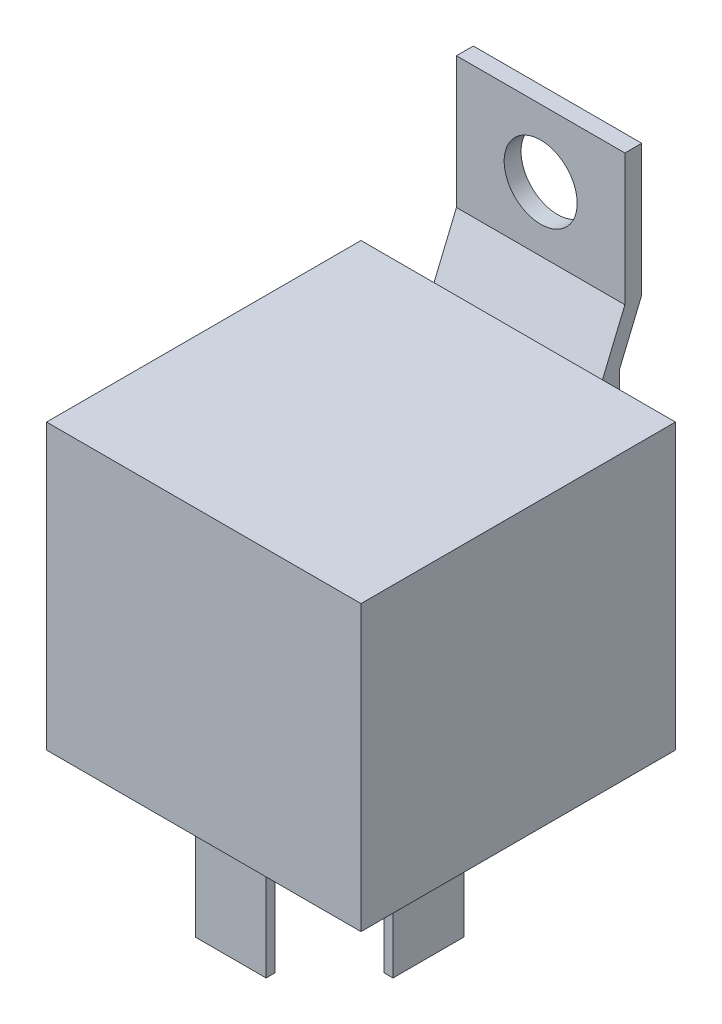
ISO-10303-21;
HEADER;
FILE_DESCRIPTION(('STEP AP214'),'2;1');
FILE_NAME('part.step','',(''),(''),'','','');
FILE_SCHEMA(('AUTOMOTIVE_DESIGN { 1 0 10303 214 1 1 1 1 }'));
ENDSEC;
DATA;
#1=APPLICATION_CONTEXT('core data for automotive mechanical design processes');
#2=APPLICATION_PROTOCOL_DEFINITION('international standard','automotive_design',2000,#1);
#3=PRODUCT_CONTEXT('',#1,'mechanical');
#4=PRODUCT('Part','Part','',(#3));
#5=PRODUCT_RELATED_PRODUCT_CATEGORY('part','',(#4));
#6=PRODUCT_DEFINITION_FORMATION('','',#4);
#7=PRODUCT_DEFINITION_CONTEXT('part definition',#1,'design');
#8=PRODUCT_DEFINITION('design','',#6,#7);
#9=PRODUCT_DEFINITION_SHAPE('','',#8);
#10=(LENGTH_UNIT() NAMED_UNIT(*) SI_UNIT(.MILLI.,.METRE.));
#11=(NAMED_UNIT(*) PLANE_ANGLE_UNIT() SI_UNIT($,.RADIAN.));
#12=(NAMED_UNIT(*) SI_UNIT($,.STERADIAN.) SOLID_ANGLE_UNIT());
#13=UNCERTAINTY_MEASURE_WITH_UNIT(LENGTH_MEASURE(1.E-05),#10,'distance_accuracy_value','');
#14=(GEOMETRIC_REPRESENTATION_CONTEXT(3) GLOBAL_UNCERTAINTY_ASSIGNED_CONTEXT((#13)) GLOBAL_UNIT_ASSIGNED_CONTEXT((#10,
#11,#12)) REPRESENTATION_CONTEXT('',''));
#15=CARTESIAN_POINT('',(0.,0.,0.));
#16=DIRECTION('',(0.,0.,1.));
#17=DIRECTION('',(1.,0.,0.));
#18=AXIS2_PLACEMENT_3D('',#15,#16,#17);
#19=CARTESIAN_POINT('',(-14.,-12.65,28.));
#20=DIRECTION('',(0.,1.,0.));
#21=DIRECTION('',(0.,0.,1.));
#22=AXIS2_PLACEMENT_3D('',#19,#20,#21);
#23=PLANE('',#22);
#24=DIRECTION('',(0.,0.,-1.));
#25=VECTOR('',#24,1.);
#26=CARTESIAN_POINT('',(-3.15,-12.65,17.6));
#27=LINE('',#26,#25);
#28=CARTESIAN_POINT('',(-3.15,-12.65,17.6));
#29=VERTEX_POINT('',#28);
#30=CARTESIAN_POINT('',(-3.15,-12.65,16.8));
#31=VERTEX_POINT('',#30);
#32=EDGE_CURVE('E262',#29,#31,#27,.T.);
#33=ORIENTED_EDGE('',*,*,#32,.F.);
#34=DIRECTION('',(-1.,0.,0.));
#35=VECTOR('',#34,1.);
#36=CARTESIAN_POINT('',(-3.15,-12.65,17.6));
#37=LINE('',#36,#35);
#38=CARTESIAN_POINT('',(3.15,-12.65,17.6));
#39=VERTEX_POINT('',#38);
#40=EDGE_CURVE('E275',#39,#29,#37,.T.);
#41=ORIENTED_EDGE('',*,*,#40,.F.);
#42=DIRECTION('',(0.,0.,1.));
#43=VECTOR('',#42,1.);
#44=CARTESIAN_POINT('',(3.15,-12.65,17.6));
#45=LINE('',#44,#43);
#46=CARTESIAN_POINT('',(3.15,-12.65,16.8));
#47=VERTEX_POINT('',#46);
#48=EDGE_CURVE('E284',#47,#39,#45,.T.);
#49=ORIENTED_EDGE('',*,*,#48,.F.);
#50=DIRECTION('',(1.,0.,0.));
#51=VECTOR('',#50,1.);
#52=CARTESIAN_POINT('',(-3.15,-12.65,16.8));
#53=LINE('',#52,#51);
#54=EDGE_CURVE('E265',#31,#47,#53,.T.);
#55=ORIENTED_EDGE('',*,*,#54,.F.);
#56=EDGE_LOOP('',(#33,#41,#49,#55));
#57=FACE_BOUND('',#56,.T.);
#58=DIRECTION('',(0.,0.,-1.));
#59=VECTOR('',#58,1.);
#60=CARTESIAN_POINT('',(-3.15,-12.65,25.6));
#61=LINE('',#60,#59);
#62=CARTESIAN_POINT('',(-3.15,-12.65,25.6));
#63=VERTEX_POINT('',#62);
#64=CARTESIAN_POINT('',(-3.15,-12.65,24.8));
#65=VERTEX_POINT('',#64);
#66=EDGE_CURVE('E333',#63,#65,#61,.T.);
#67=ORIENTED_EDGE('',*,*,#66,.F.);
#68=DIRECTION('',(-1.,0.,0.));
#69=VECTOR('',#68,1.);
#70=CARTESIAN_POINT('',(-3.15,-12.65,25.6));
#71=LINE('',#70,#69);
#72=CARTESIAN_POINT('',(3.15,-12.65,25.6));
#73=VERTEX_POINT('',#72);
#74=EDGE_CURVE('E338',#73,#63,#71,.T.);
#75=ORIENTED_EDGE('',*,*,#74,.F.);
#76=DIRECTION('',(0.,0.,1.));
#77=VECTOR('',#76,1.);
#78=CARTESIAN_POINT('',(3.15,-12.65,25.6));
#79=LINE('',#78,#77);
#80=CARTESIAN_POINT('',(3.15,-12.65,24.8));
#81=VERTEX_POINT('',#80);
#82=EDGE_CURVE('E350',#81,#73,#79,.T.);
#83=ORIENTED_EDGE('',*,*,#82,.F.);
#84=DIRECTION('',(1.,0.,0.));
#85=VECTOR('',#84,1.);
#86=CARTESIAN_POINT('',(-3.15,-12.65,24.8));
#87=LINE('',#86,#85);
#88=EDGE_CURVE('E347',#65,#81,#87,.T.);
#89=ORIENTED_EDGE('',*,*,#88,.F.);
#90=EDGE_LOOP('',(#67,#75,#83,#89));
#91=FACE_BOUND('',#90,.T.);
#92=DIRECTION('',(1.,0.,0.));
#93=VECTOR('',#92,1.);
#94=CARTESIAN_POINT('',(-14.,-12.65,0.));
#95=LINE('',#94,#93);
#96=CARTESIAN_POINT('',(-14.,-12.65,0.));
#97=VERTEX_POINT('',#96);
#98=CARTESIAN_POINT('',(14.,-12.65,0.));
#99=VERTEX_POINT('',#98);
#100=EDGE_CURVE('E478',#97,#99,#95,.T.);
#101=ORIENTED_EDGE('',*,*,#100,.T.);
#102=DIRECTION('',(0.,0.,-1.));
#103=VECTOR('',#102,1.);
#104=CARTESIAN_POINT('',(14.,-12.65,28.));
#105=LINE('',#104,#103);
#106=CARTESIAN_POINT('',(14.,-12.65,28.));
#107=VERTEX_POINT('',#106);
#108=EDGE_CURVE('E40',#107,#99,#105,.T.);
#109=ORIENTED_EDGE('',*,*,#108,.F.);
#110=DIRECTION('',(1.,0.,0.));
#111=VECTOR('',#110,1.);
#112=CARTESIAN_POINT('',(-14.,-12.65,28.));
#113=LINE('',#112,#111);
#114=CARTESIAN_POINT('',(-14.,-12.65,28.));
#115=VERTEX_POINT('',#114);
#116=EDGE_CURVE('E468',#115,#107,#113,.T.);
#117=ORIENTED_EDGE('',*,*,#116,.F.);
#118=DIRECTION('',(0.,0.,-1.));
#119=VECTOR('',#118,1.);
#120=CARTESIAN_POINT('',(-14.,-12.65,28.));
#121=LINE('',#120,#119);
#122=EDGE_CURVE('E11',#115,#97,#121,.T.);
#123=ORIENTED_EDGE('',*,*,#122,.T.);
#124=EDGE_LOOP('',(#101,#109,#117,#123));
#125=FACE_BOUND('',#124,.T.);
#126=DIRECTION('',(0.,0.,-1.));
#127=VECTOR('',#126,1.);
#128=CARTESIAN_POINT('',(-0.399999999999997,-12.65,10.45));
#129=LINE('',#128,#127);
#130=CARTESIAN_POINT('',(-0.399999999999997,-12.65,10.45));
#131=VERTEX_POINT('',#130);
#132=CARTESIAN_POINT('',(-0.399999999999998,-12.65,4.14999999999999));
#133=VERTEX_POINT('',#132);
#134=EDGE_CURVE('E366',#131,#133,#129,.T.);
#135=ORIENTED_EDGE('',*,*,#134,.F.);
#136=DIRECTION('',(-1.,0.,0.));
#137=VECTOR('',#136,1.);
#138=CARTESIAN_POINT('',(-0.399999999999997,-12.65,10.45));
#139=LINE('',#138,#137);
#140=CARTESIAN_POINT('',(0.400000000000005,-12.65,10.45));
#141=VERTEX_POINT('',#140);
#142=EDGE_CURVE('E371',#141,#131,#139,.T.);
#143=ORIENTED_EDGE('',*,*,#142,.F.);
#144=DIRECTION('',(0.,0.,1.));
#145=VECTOR('',#144,1.);
#146=CARTESIAN_POINT('',(0.400000000000004,-12.65,10.45));
#147=LINE('',#146,#145);
#148=CARTESIAN_POINT('',(0.400000000000004,-12.65,4.15));
#149=VERTEX_POINT('',#148);
#150=EDGE_CURVE('E383',#149,#141,#147,.T.);
#151=ORIENTED_EDGE('',*,*,#150,.F.);
#152=DIRECTION('',(1.,0.,0.));
#153=VECTOR('',#152,1.);
#154=CARTESIAN_POINT('',(-0.399999999999997,-12.65,4.14999999999999));
#155=LINE('',#154,#153);
#156=EDGE_CURVE('E380',#133,#149,#155,.T.);
#157=ORIENTED_EDGE('',*,*,#156,.F.);
#158=EDGE_LOOP('',(#135,#143,#151,#157));
#159=FACE_BOUND('',#158,.T.);
#160=DIRECTION('',(0.,0.,-1.));
#161=VECTOR('',#160,1.);
#162=CARTESIAN_POINT('',(-8.79999999999999,-12.65,19.95));
#163=LINE('',#162,#161);
#164=CARTESIAN_POINT('',(-8.79999999999999,-12.65,19.95));
#165=VERTEX_POINT('',#164);
#166=CARTESIAN_POINT('',(-8.79999999999999,-12.65,13.65));
#167=VERTEX_POINT('',#166);
#168=EDGE_CURVE('E300',#165,#167,#163,.T.);
#169=ORIENTED_EDGE('',*,*,#168,.F.);
#170=DIRECTION('',(-1.,0.,0.));
#171=VECTOR('',#170,1.);
#172=CARTESIAN_POINT('',(-8.79999999999999,-12.65,19.95));
#173=LINE('',#172,#171);
#174=CARTESIAN_POINT('',(-7.99999999999999,-12.65,19.95));
#175=VERTEX_POINT('',#174);
#176=EDGE_CURVE('E305',#175,#165,#173,.T.);
#177=ORIENTED_EDGE('',*,*,#176,.F.);
#178=DIRECTION('',(0.,0.,1.));
#179=VECTOR('',#178,1.);
#180=CARTESIAN_POINT('',(-7.99999999999999,-12.65,19.95));
#181=LINE('',#180,#179);
#182=CARTESIAN_POINT('',(-7.99999999999999,-12.65,13.65));
#183=VERTEX_POINT('',#182);
#184=EDGE_CURVE('E317',#183,#175,#181,.T.);
#185=ORIENTED_EDGE('',*,*,#184,.F.);
#186=DIRECTION('',(1.,0.,0.));
#187=VECTOR('',#186,1.);
#188=CARTESIAN_POINT('',(-8.79999999999999,-12.65,13.65));
#189=LINE('',#188,#187);
#190=EDGE_CURVE('E314',#167,#183,#189,.T.);
#191=ORIENTED_EDGE('',*,*,#190,.F.);
#192=EDGE_LOOP('',(#169,#177,#185,#191));
#193=FACE_BOUND('',#192,.T.);
#194=DIRECTION('',(0.,0.,1.));
#195=VECTOR('',#194,1.);
#196=CARTESIAN_POINT('',(8.79999999999999,-12.65,19.95));
#197=LINE('',#196,#195);
#198=CARTESIAN_POINT('',(8.8,-12.65,13.65));
#199=VERTEX_POINT('',#198);
#200=CARTESIAN_POINT('',(8.79999999999999,-12.65,19.95));
#201=VERTEX_POINT('',#200);
#202=EDGE_CURVE('E261',#199,#201,#197,.T.);
#203=ORIENTED_EDGE('',*,*,#202,.F.);
#204=DIRECTION('',(1.,0.,0.));
#205=VECTOR('',#204,1.);
#206=CARTESIAN_POINT('',(8.8,-12.65,13.65));
#207=LINE('',#206,#205);
#208=CARTESIAN_POINT('',(8.,-12.65,13.65));
#209=VERTEX_POINT('',#208);
#210=EDGE_CURVE('E258',#209,#199,#207,.T.);
#211=ORIENTED_EDGE('',*,*,#210,.F.);
#212=DIRECTION('',(0.,0.,-1.));
#213=VECTOR('',#212,1.);
#214=CARTESIAN_POINT('',(8.,-12.65,19.95));
#215=LINE('',#214,#213);
#216=CARTESIAN_POINT('',(8.,-12.65,19.95));
#217=VERTEX_POINT('',#216);
#218=EDGE_CURVE('E52',#217,#209,#215,.T.);
#219=ORIENTED_EDGE('',*,*,#218,.F.);
#220=DIRECTION('',(-1.,0.,0.));
#221=VECTOR('',#220,1.);
#222=CARTESIAN_POINT('',(8.79999999999999,-12.65,19.95));
#223=LINE('',#222,#221);
#224=EDGE_CURVE('E47',#201,#217,#223,.T.);
#225=ORIENTED_EDGE('',*,*,#224,.F.);
#226=EDGE_LOOP('',(#203,#211,#219,#225));
#227=FACE_BOUND('',#226,.T.);
#228=ADVANCED_FACE('F32',(#57,#91,#125,#159,#193,#227),#23,.F.);
#229=CARTESIAN_POINT('',(-14.,12.65,28.));
#230=DIRECTION('',(1.,0.,0.));
#231=DIRECTION('',(0.,1.,0.));
#232=AXIS2_PLACEMENT_3D('',#229,#230,#231);
#233=PLANE('',#232);
#234=DIRECTION('',(0.,-1.,0.));
#235=VECTOR('',#234,1.);
#236=CARTESIAN_POINT('',(-14.,12.65,0.));
#237=LINE('',#236,#235);
#238=CARTESIAN_POINT('',(-14.,12.65,0.));
#239=VERTEX_POINT('',#238);
#240=EDGE_CURVE('E464',#239,#97,#237,.T.);
#241=ORIENTED_EDGE('',*,*,#240,.T.);
#242=ORIENTED_EDGE('',*,*,#122,.F.);
#243=DIRECTION('',(0.,-1.,0.));
#244=VECTOR('',#243,1.);
#245=CARTESIAN_POINT('',(-14.,12.65,28.));
#246=LINE('',#245,#244);
#247=CARTESIAN_POINT('',(-14.,12.65,28.));
#248=VERTEX_POINT('',#247);
#249=EDGE_CURVE('E465',#248,#115,#246,.T.);
#250=ORIENTED_EDGE('',*,*,#249,.F.);
#251=DIRECTION('',(0.,0.,-1.));
#252=VECTOR('',#251,1.);
#253=CARTESIAN_POINT('',(-14.,12.65,28.));
#254=LINE('',#253,#252);
#255=EDGE_CURVE('E475',#248,#239,#254,.T.);
#256=ORIENTED_EDGE('',*,*,#255,.T.);
#257=EDGE_LOOP('',(#241,#242,#250,#256));
#258=FACE_BOUND('',#257,.T.);
#259=ADVANCED_FACE('F34',(#258),#233,.F.);
#260=CARTESIAN_POINT('',(14.,12.65,28.));
#261=DIRECTION('',(-1.,0.,0.));
#262=DIRECTION('',(0.,0.,1.));
#263=AXIS2_PLACEMENT_3D('',#260,#261,#262);
#264=PLANE('',#263);
#265=DIRECTION('',(0.,1.,0.));
#266=VECTOR('',#265,1.);
#267=CARTESIAN_POINT('',(14.,12.65,0.));
#268=LINE('',#267,#266);
#269=CARTESIAN_POINT('',(14.,12.65,0.));
#270=VERTEX_POINT('',#269);
#271=EDGE_CURVE('E480',#99,#270,#268,.T.);
#272=ORIENTED_EDGE('',*,*,#271,.T.);
#273=DIRECTION('',(0.,0.,-1.));
#274=VECTOR('',#273,1.);
#275=CARTESIAN_POINT('',(14.,12.65,28.));
#276=LINE('',#275,#274);
#277=CARTESIAN_POINT('',(14.,12.65,28.));
#278=VERTEX_POINT('',#277);
#279=EDGE_CURVE('E487',#278,#270,#276,.T.);
#280=ORIENTED_EDGE('',*,*,#279,.F.);
#281=DIRECTION('',(0.,1.,0.));
#282=VECTOR('',#281,1.);
#283=CARTESIAN_POINT('',(14.,12.65,28.));
#284=LINE('',#283,#282);
#285=EDGE_CURVE('E471',#107,#278,#284,.T.);
#286=ORIENTED_EDGE('',*,*,#285,.F.);
#287=ORIENTED_EDGE('',*,*,#108,.T.);
#288=EDGE_LOOP('',(#272,#280,#286,#287));
#289=FACE_BOUND('',#288,.T.);
#290=ADVANCED_FACE('F494',(#289),#264,.F.);
#291=CARTESIAN_POINT('',(-14.,12.65,28.));
#292=DIRECTION('',(0.,-1.,0.));
#293=DIRECTION('',(0.,0.,-1.));
#294=AXIS2_PLACEMENT_3D('',#291,#292,#293);
#295=PLANE('',#294);
#296=DIRECTION('',(-1.,0.,0.));
#297=VECTOR('',#296,1.);
#298=CARTESIAN_POINT('',(-14.,12.65,0.));
#299=LINE('',#298,#297);
#300=CARTESIAN_POINT('',(7.5,12.65,0.));
#301=VERTEX_POINT('',#300);
#302=EDGE_CURVE('E469',#270,#301,#299,.T.);
#303=ORIENTED_EDGE('',*,*,#302,.T.);
#304=DIRECTION('',(-1.,0.,0.));
#305=VECTOR('',#304,1.);
#306=CARTESIAN_POINT('',(7.5,12.65,0.));
#307=LINE('',#306,#305);
#308=CARTESIAN_POINT('',(-7.5,12.65,0.));
#309=VERTEX_POINT('',#308);
#310=EDGE_CURVE('E425',#301,#309,#307,.T.);
#311=ORIENTED_EDGE('',*,*,#310,.T.);
#312=EDGE_CURVE('E482',#309,#239,#299,.T.);
#313=ORIENTED_EDGE('',*,*,#312,.T.);
#314=ORIENTED_EDGE('',*,*,#255,.F.);
#315=DIRECTION('',(-1.,0.,0.));
#316=VECTOR('',#315,1.);
#317=CARTESIAN_POINT('',(-14.,12.65,28.));
#318=LINE('',#317,#316);
#319=EDGE_CURVE('E473',#278,#248,#318,.T.);
#320=ORIENTED_EDGE('',*,*,#319,.F.);
#321=ORIENTED_EDGE('',*,*,#279,.T.);
#322=EDGE_LOOP('',(#303,#311,#313,#314,#320,#321));
#323=FACE_BOUND('',#322,.T.);
#324=ADVANCED_FACE('F502',(#323),#295,.F.);
#325=CARTESIAN_POINT('',(0.,0.,28.));
#326=DIRECTION('',(0.,0.,1.));
#327=DIRECTION('',(1.,0.,0.));
#328=AXIS2_PLACEMENT_3D('',#325,#326,#327);
#329=PLANE('',#328);
#330=ORIENTED_EDGE('',*,*,#249,.T.);
#331=ORIENTED_EDGE('',*,*,#116,.T.);
#332=ORIENTED_EDGE('',*,*,#285,.T.);
#333=ORIENTED_EDGE('',*,*,#319,.T.);
#334=EDGE_LOOP('',(#330,#331,#332,#333));
#335=FACE_BOUND('',#334,.T.);
#336=ADVANCED_FACE('F525',(#335),#329,.T.);
#337=CARTESIAN_POINT('',(0.,0.,0.));
#338=DIRECTION('',(0.,0.,1.));
#339=DIRECTION('',(1.,0.,0.));
#340=AXIS2_PLACEMENT_3D('',#337,#338,#339);
#341=PLANE('',#340);
#342=ORIENTED_EDGE('',*,*,#312,.F.);
#343=DIRECTION('',(0.,-1.,0.));
#344=VECTOR('',#343,1.);
#345=CARTESIAN_POINT('',(-7.5,-3.07393152780374,0.));
#346=LINE('',#345,#344);
#347=CARTESIAN_POINT('',(-7.5,-3.07393152780374,0.));
#348=VERTEX_POINT('',#347);
#349=EDGE_CURVE('E403',#309,#348,#346,.T.);
#350=ORIENTED_EDGE('',*,*,#349,.T.);
#351=DIRECTION('',(-1.,0.,0.));
#352=VECTOR('',#351,1.);
#353=CARTESIAN_POINT('',(7.5,-3.07393152780374,0.));
#354=LINE('',#353,#352);
#355=CARTESIAN_POINT('',(7.5,-3.07393152780374,0.));
#356=VERTEX_POINT('',#355);
#357=EDGE_CURVE('E461',#356,#348,#354,.T.);
#358=ORIENTED_EDGE('',*,*,#357,.F.);
#359=DIRECTION('',(0.,-1.,0.));
#360=VECTOR('',#359,1.);
#361=CARTESIAN_POINT('',(7.5,-3.07393152780374,0.));
#362=LINE('',#361,#360);
#363=EDGE_CURVE('E406',#301,#356,#362,.T.);
#364=ORIENTED_EDGE('',*,*,#363,.F.);
#365=ORIENTED_EDGE('',*,*,#302,.F.);
#366=ORIENTED_EDGE('',*,*,#271,.F.);
#367=ORIENTED_EDGE('',*,*,#100,.F.);
#368=ORIENTED_EDGE('',*,*,#240,.F.);
#369=EDGE_LOOP('',(#342,#350,#358,#364,#365,#366,#367,#368));
#370=FACE_BOUND('',#369,.T.);
#371=ADVANCED_FACE('F499',(#370),#341,.F.);
#372=CARTESIAN_POINT('',(7.5,-3.07393152780374,-1.5));
#373=DIRECTION('',(0.,1.,0.));
#374=DIRECTION('',(0.,0.,1.));
#375=AXIS2_PLACEMENT_3D('',#372,#373,#374);
#376=PLANE('',#375);
#377=DIRECTION('',(0.,0.,-1.));
#378=VECTOR('',#377,1.);
#379=CARTESIAN_POINT('',(-7.5,-3.07393152780374,-1.5));
#380=LINE('',#379,#378);
#381=CARTESIAN_POINT('',(-7.5,-3.07393152780374,-1.5));
#382=VERTEX_POINT('',#381);
#383=EDGE_CURVE('E427',#348,#382,#380,.T.);
#384=ORIENTED_EDGE('',*,*,#383,.T.);
#385=DIRECTION('',(-1.,0.,0.));
#386=VECTOR('',#385,1.);
#387=CARTESIAN_POINT('',(7.5,-3.07393152780374,-1.5));
#388=LINE('',#387,#386);
#389=CARTESIAN_POINT('',(7.5,-3.07393152780374,-1.5));
#390=VERTEX_POINT('',#389);
#391=EDGE_CURVE('E458',#390,#382,#388,.T.);
#392=ORIENTED_EDGE('',*,*,#391,.F.);
#393=DIRECTION('',(0.,0.,-1.));
#394=VECTOR('',#393,1.);
#395=CARTESIAN_POINT('',(7.5,-3.07393152780374,-1.5));
#396=LINE('',#395,#394);
#397=EDGE_CURVE('E409',#356,#390,#396,.T.);
#398=ORIENTED_EDGE('',*,*,#397,.F.);
#399=ORIENTED_EDGE('',*,*,#357,.T.);
#400=EDGE_LOOP('',(#384,#392,#398,#399));
#401=FACE_BOUND('',#400,.T.);
#402=ADVANCED_FACE('F666',(#401),#376,.F.);
#403=CARTESIAN_POINT('',(7.5,12.65,-1.5));
#404=DIRECTION('',(0.,0.,1.));
#405=DIRECTION('',(0.,-1.,0.));
#406=AXIS2_PLACEMENT_3D('',#403,#404,#405);
#407=PLANE('',#406);
#408=DIRECTION('',(0.,1.,0.));
#409=VECTOR('',#408,1.);
#410=CARTESIAN_POINT('',(-7.5,12.65,-1.5));
#411=LINE('',#410,#409);
#412=CARTESIAN_POINT('',(-7.5,12.65,-1.5));
#413=VERTEX_POINT('',#412);
#414=EDGE_CURVE('E429',#382,#413,#411,.T.);
#415=ORIENTED_EDGE('',*,*,#414,.T.);
#416=DIRECTION('',(-1.,0.,0.));
#417=VECTOR('',#416,1.);
#418=CARTESIAN_POINT('',(7.5,12.65,-1.5));
#419=LINE('',#418,#417);
#420=CARTESIAN_POINT('',(7.5,12.65,-1.5));
#421=VERTEX_POINT('',#420);
#422=EDGE_CURVE('E455',#421,#413,#419,.T.);
#423=ORIENTED_EDGE('',*,*,#422,.F.);
#424=DIRECTION('',(0.,1.,0.));
#425=VECTOR('',#424,1.);
#426=CARTESIAN_POINT('',(7.5,12.65,-1.5));
#427=LINE('',#426,#425);
#428=EDGE_CURVE('E412',#390,#421,#427,.T.);
#429=ORIENTED_EDGE('',*,*,#428,.F.);
#430=ORIENTED_EDGE('',*,*,#391,.T.);
#431=EDGE_LOOP('',(#415,#423,#429,#430));
#432=FACE_BOUND('',#431,.T.);
#433=ADVANCED_FACE('F662',(#432),#407,.F.);
#434=CARTESIAN_POINT('',(7.5,17.4464921900217,-3.5));
#435=DIRECTION('',(0.,0.384855016316531,0.922977040026458));
#436=DIRECTION('',(0.,-0.922977040026459,0.384855016316531));
#437=AXIS2_PLACEMENT_3D('',#434,#435,#436);
#438=PLANE('',#437);
#439=DIRECTION('',(0.,0.922977040026458,-0.384855016316531));
#440=VECTOR('',#439,1.);
#441=CARTESIAN_POINT('',(-7.5,17.4464921900217,-3.5));
#442=LINE('',#441,#440);
#443=CARTESIAN_POINT('',(-7.5,17.4464921900217,-3.5));
#444=VERTEX_POINT('',#443);
#445=EDGE_CURVE('E431',#413,#444,#442,.T.);
#446=ORIENTED_EDGE('',*,*,#445,.T.);
#447=DIRECTION('',(-1.,0.,0.));
#448=VECTOR('',#447,1.);
#449=CARTESIAN_POINT('',(7.5,17.4464921900217,-3.5));
#450=LINE('',#449,#448);
#451=CARTESIAN_POINT('',(7.5,17.4464921900217,-3.5));
#452=VERTEX_POINT('',#451);
#453=EDGE_CURVE('E452',#452,#444,#450,.T.);
#454=ORIENTED_EDGE('',*,*,#453,.F.);
#455=DIRECTION('',(0.,0.922977040026458,-0.384855016316531));
#456=VECTOR('',#455,1.);
#457=CARTESIAN_POINT('',(7.5,17.4464921900217,-3.5));
#458=LINE('',#457,#456);
#459=EDGE_CURVE('E414',#421,#452,#458,.T.);
#460=ORIENTED_EDGE('',*,*,#459,.F.);
#461=ORIENTED_EDGE('',*,*,#422,.T.);
#462=EDGE_LOOP('',(#446,#454,#460,#461));
#463=FACE_BOUND('',#462,.T.);
#464=ADVANCED_FACE('F658',(#463),#438,.F.);
#465=CARTESIAN_POINT('',(7.5,29.15,-3.5));
#466=DIRECTION('',(0.,0.,1.));
#467=DIRECTION('',(0.,-1.,0.));
#468=AXIS2_PLACEMENT_3D('',#465,#466,#467);
#469=PLANE('',#468);
#470=CARTESIAN_POINT('',(0.,23.15,-3.5));
#471=DIRECTION('',(0.,0.,1.));
#472=DIRECTION('',(1.,0.,0.));
#473=AXIS2_PLACEMENT_3D('',#470,#471,#472);
#474=CIRCLE('',#473,3.25);
#475=CARTESIAN_POINT('',(3.25,23.15,-3.5));
#476=VERTEX_POINT('',#475);
#477=EDGE_CURVE('E400',#476,#476,#474,.T.);
#478=ORIENTED_EDGE('',*,*,#477,.T.);
#479=EDGE_LOOP('',(#478));
#480=FACE_BOUND('',#479,.T.);
#481=DIRECTION('',(0.,1.,0.));
#482=VECTOR('',#481,1.);
#483=CARTESIAN_POINT('',(-7.5,29.15,-3.5));
#484=LINE('',#483,#482);
#485=CARTESIAN_POINT('',(-7.5,29.15,-3.5));
#486=VERTEX_POINT('',#485);
#487=EDGE_CURVE('E433',#444,#486,#484,.T.);
#488=ORIENTED_EDGE('',*,*,#487,.T.);
#489=DIRECTION('',(-1.,0.,0.));
#490=VECTOR('',#489,1.);
#491=CARTESIAN_POINT('',(7.5,29.15,-3.5));
#492=LINE('',#491,#490);
#493=CARTESIAN_POINT('',(7.5,29.15,-3.5));
#494=VERTEX_POINT('',#493);
#495=EDGE_CURVE('E449',#494,#486,#492,.T.);
#496=ORIENTED_EDGE('',*,*,#495,.F.);
#497=DIRECTION('',(0.,1.,0.));
#498=VECTOR('',#497,1.);
#499=CARTESIAN_POINT('',(7.5,29.15,-3.5));
#500=LINE('',#499,#498);
#501=EDGE_CURVE('E416',#452,#494,#500,.T.);
#502=ORIENTED_EDGE('',*,*,#501,.F.);
#503=ORIENTED_EDGE('',*,*,#453,.T.);
#504=EDGE_LOOP('',(#488,#496,#502,#503));
#505=FACE_BOUND('',#504,.T.);
#506=ADVANCED_FACE('F654',(#480,#505),#469,.F.);
#507=CARTESIAN_POINT('',(7.5,29.15,-2.));
#508=DIRECTION('',(0.,-1.,0.));
#509=DIRECTION('',(0.,0.,-1.));
#510=AXIS2_PLACEMENT_3D('',#507,#508,#509);
#511=PLANE('',#510);
#512=DIRECTION('',(0.,0.,1.));
#513=VECTOR('',#512,1.);
#514=CARTESIAN_POINT('',(-7.5,29.15,-2.));
#515=LINE('',#514,#513);
#516=CARTESIAN_POINT('',(-7.5,29.15,-2.));
#517=VERTEX_POINT('',#516);
#518=EDGE_CURVE('E435',#486,#517,#515,.T.);
#519=ORIENTED_EDGE('',*,*,#518,.T.);
#520=DIRECTION('',(-1.,0.,0.));
#521=VECTOR('',#520,1.);
#522=CARTESIAN_POINT('',(7.5,29.15,-2.));
#523=LINE('',#522,#521);
#524=CARTESIAN_POINT('',(7.5,29.15,-2.));
#525=VERTEX_POINT('',#524);
#526=EDGE_CURVE('E446',#525,#517,#523,.T.);
#527=ORIENTED_EDGE('',*,*,#526,.F.);
#528=DIRECTION('',(0.,0.,1.));
#529=VECTOR('',#528,1.);
#530=CARTESIAN_POINT('',(7.5,29.15,-2.));
#531=LINE('',#530,#529);
#532=EDGE_CURVE('E418',#494,#525,#531,.T.);
#533=ORIENTED_EDGE('',*,*,#532,.F.);
#534=ORIENTED_EDGE('',*,*,#495,.T.);
#535=EDGE_LOOP('',(#519,#527,#533,#534));
#536=FACE_BOUND('',#535,.T.);
#537=ADVANCED_FACE('F650',(#536),#511,.F.);
#538=CARTESIAN_POINT('',(7.5,17.4464921900217,-2.));
#539=DIRECTION('',(0.,0.,-1.));
#540=DIRECTION('',(0.,1.,0.));
#541=AXIS2_PLACEMENT_3D('',#538,#539,#540);
#542=PLANE('',#541);
#543=CARTESIAN_POINT('',(0.,23.15,-2.));
#544=DIRECTION('',(0.,0.,1.));
#545=DIRECTION('',(1.,0.,0.));
#546=AXIS2_PLACEMENT_3D('',#543,#544,#545);
#547=CIRCLE('',#546,3.25);
#548=CARTESIAN_POINT('',(3.25,23.15,-2.));
#549=VERTEX_POINT('',#548);
#550=EDGE_CURVE('E399',#549,#549,#547,.T.);
#551=ORIENTED_EDGE('',*,*,#550,.F.);
#552=EDGE_LOOP('',(#551));
#553=FACE_BOUND('',#552,.T.);
#554=DIRECTION('',(0.,-1.,0.));
#555=VECTOR('',#554,1.);
#556=CARTESIAN_POINT('',(-7.5,17.4464921900217,-2.));
#557=LINE('',#556,#555);
#558=CARTESIAN_POINT('',(-7.5,17.4464921900217,-2.));
#559=VERTEX_POINT('',#558);
#560=EDGE_CURVE('E437',#517,#559,#557,.T.);
#561=ORIENTED_EDGE('',*,*,#560,.T.);
#562=DIRECTION('',(-1.,0.,0.));
#563=VECTOR('',#562,1.);
#564=CARTESIAN_POINT('',(7.5,17.4464921900217,-2.));
#565=LINE('',#564,#563);
#566=CARTESIAN_POINT('',(7.5,17.4464921900217,-2.));
#567=VERTEX_POINT('',#566);
#568=EDGE_CURVE('E443',#567,#559,#565,.T.);
#569=ORIENTED_EDGE('',*,*,#568,.F.);
#570=DIRECTION('',(0.,-1.,0.));
#571=VECTOR('',#570,1.);
#572=CARTESIAN_POINT('',(7.5,17.4464921900217,-2.));
#573=LINE('',#572,#571);
#574=EDGE_CURVE('E420',#525,#567,#573,.T.);
#575=ORIENTED_EDGE('',*,*,#574,.F.);
#576=ORIENTED_EDGE('',*,*,#526,.T.);
#577=EDGE_LOOP('',(#561,#569,#575,#576));
#578=FACE_BOUND('',#577,.T.);
#579=ADVANCED_FACE('F647',(#553,#578),#542,.F.);
#580=CARTESIAN_POINT('',(7.5,12.65,0.));
#581=DIRECTION('',(0.,-0.384855016316531,-0.922977040026458));
#582=DIRECTION('',(0.,0.922977040026458,-0.384855016316531));
#583=AXIS2_PLACEMENT_3D('',#580,#581,#582);
#584=PLANE('',#583);
#585=DIRECTION('',(0.,-0.922977040026458,0.384855016316531));
#586=VECTOR('',#585,1.);
#587=CARTESIAN_POINT('',(-7.5,12.65,0.));
#588=LINE('',#587,#586);
#589=EDGE_CURVE('E410',#559,#309,#588,.T.);
#590=ORIENTED_EDGE('',*,*,#589,.T.);
#591=ORIENTED_EDGE('',*,*,#310,.F.);
#592=DIRECTION('',(0.,-0.922977040026458,0.384855016316531));
#593=VECTOR('',#592,1.);
#594=CARTESIAN_POINT('',(7.5,12.65,0.));
#595=LINE('',#594,#593);
#596=EDGE_CURVE('E422',#567,#301,#595,.T.);
#597=ORIENTED_EDGE('',*,*,#596,.F.);
#598=ORIENTED_EDGE('',*,*,#568,.T.);
#599=EDGE_LOOP('',(#590,#591,#597,#598));
#600=FACE_BOUND('',#599,.T.);
#601=ADVANCED_FACE('F511',(#600),#584,.F.);
#602=CARTESIAN_POINT('',(7.5,0.,0.));
#603=DIRECTION('',(-1.,0.,0.));
#604=DIRECTION('',(0.,0.,1.));
#605=AXIS2_PLACEMENT_3D('',#602,#603,#604);
#606=PLANE('',#605);
#607=ORIENTED_EDGE('',*,*,#363,.T.);
#608=ORIENTED_EDGE('',*,*,#397,.T.);
#609=ORIENTED_EDGE('',*,*,#428,.T.);
#610=ORIENTED_EDGE('',*,*,#459,.T.);
#611=ORIENTED_EDGE('',*,*,#501,.T.);
#612=ORIENTED_EDGE('',*,*,#532,.T.);
#613=ORIENTED_EDGE('',*,*,#574,.T.);
#614=ORIENTED_EDGE('',*,*,#596,.T.);
#615=EDGE_LOOP('',(#607,#608,#609,#610,#611,#612,#613,#614));
#616=FACE_BOUND('',#615,.T.);
#617=ADVANCED_FACE('F507',(#616),#606,.F.);
#618=CARTESIAN_POINT('',(-7.5,0.,0.));
#619=DIRECTION('',(-1.,0.,0.));
#620=DIRECTION('',(0.,0.,1.));
#621=AXIS2_PLACEMENT_3D('',#618,#619,#620);
#622=PLANE('',#621);
#623=ORIENTED_EDGE('',*,*,#349,.F.);
#624=ORIENTED_EDGE('',*,*,#589,.F.);
#625=ORIENTED_EDGE('',*,*,#560,.F.);
#626=ORIENTED_EDGE('',*,*,#518,.F.);
#627=ORIENTED_EDGE('',*,*,#487,.F.);
#628=ORIENTED_EDGE('',*,*,#445,.F.);
#629=ORIENTED_EDGE('',*,*,#414,.F.);
#630=ORIENTED_EDGE('',*,*,#383,.F.);
#631=EDGE_LOOP('',(#623,#624,#625,#626,#627,#628,#629,#630));
#632=FACE_BOUND('',#631,.T.);
#633=ADVANCED_FACE('F517',(#632),#622,.T.);
#634=CARTESIAN_POINT('',(0.,23.15,-3.5));
#635=DIRECTION('',(0.,0.,1.));
#636=DIRECTION('',(1.,0.,0.));
#637=AXIS2_PLACEMENT_3D('',#634,#635,#636);
#638=CYLINDRICAL_SURFACE('',#637,3.25);
#639=ORIENTED_EDGE('',*,*,#477,.F.);
#640=EDGE_LOOP('',(#639));
#641=FACE_BOUND('',#640,.T.);
#642=ORIENTED_EDGE('',*,*,#550,.T.);
#643=EDGE_LOOP('',(#642));
#644=FACE_BOUND('',#643,.T.);
#645=ADVANCED_FACE('F636',(#641,#644),#638,.F.);
#646=CARTESIAN_POINT('',(-0.399999999999997,-22.85,10.45));
#647=DIRECTION('',(1.,0.,0.));
#648=DIRECTION('',(0.,0.,-1.));
#649=AXIS2_PLACEMENT_3D('',#646,#647,#648);
#650=PLANE('',#649);
#651=ORIENTED_EDGE('',*,*,#134,.T.);
#652=DIRECTION('',(0.,1.,0.));
#653=VECTOR('',#652,1.);
#654=CARTESIAN_POINT('',(-0.399999999999997,-22.85,4.14999999999999));
#655=LINE('',#654,#653);
#656=CARTESIAN_POINT('',(-0.399999999999997,-22.85,4.14999999999999));
#657=VERTEX_POINT('',#656);
#658=EDGE_CURVE('E396',#657,#133,#655,.T.);
#659=ORIENTED_EDGE('',*,*,#658,.F.);
#660=DIRECTION('',(0.,0.,-1.));
#661=VECTOR('',#660,1.);
#662=CARTESIAN_POINT('',(-0.399999999999997,-22.85,10.45));
#663=LINE('',#662,#661);
#664=CARTESIAN_POINT('',(-0.399999999999997,-22.85,10.45));
#665=VERTEX_POINT('',#664);
#666=EDGE_CURVE('E367',#665,#657,#663,.T.);
#667=ORIENTED_EDGE('',*,*,#666,.F.);
#668=DIRECTION('',(0.,1.,0.));
#669=VECTOR('',#668,1.);
#670=CARTESIAN_POINT('',(-0.399999999999997,-22.85,10.45));
#671=LINE('',#670,#669);
#672=EDGE_CURVE('E377',#665,#131,#671,.T.);
#673=ORIENTED_EDGE('',*,*,#672,.T.);
#674=EDGE_LOOP('',(#651,#659,#667,#673));
#675=FACE_BOUND('',#674,.T.);
#676=ADVANCED_FACE('F632',(#675),#650,.F.);
#677=CARTESIAN_POINT('',(-0.399999999999997,-22.85,4.14999999999999));
#678=DIRECTION('',(0.,0.,1.));
#679=DIRECTION('',(1.,0.,0.));
#680=AXIS2_PLACEMENT_3D('',#677,#678,#679);
#681=PLANE('',#680);
#682=ORIENTED_EDGE('',*,*,#156,.T.);
#683=DIRECTION('',(0.,1.,0.));
#684=VECTOR('',#683,1.);
#685=CARTESIAN_POINT('',(0.400000000000004,-22.85,4.14999999999999));
#686=LINE('',#685,#684);
#687=CARTESIAN_POINT('',(0.400000000000004,-22.85,4.14999999999999));
#688=VERTEX_POINT('',#687);
#689=EDGE_CURVE('E393',#688,#149,#686,.T.);
#690=ORIENTED_EDGE('',*,*,#689,.F.);
#691=DIRECTION('',(1.,0.,0.));
#692=VECTOR('',#691,1.);
#693=CARTESIAN_POINT('',(-0.399999999999997,-22.85,4.14999999999999));
#694=LINE('',#693,#692);
#695=EDGE_CURVE('E370',#657,#688,#694,.T.);
#696=ORIENTED_EDGE('',*,*,#695,.F.);
#697=ORIENTED_EDGE('',*,*,#658,.T.);
#698=EDGE_LOOP('',(#682,#690,#696,#697));
#699=FACE_BOUND('',#698,.T.);
#700=ADVANCED_FACE('F628',(#699),#681,.F.);
#701=CARTESIAN_POINT('',(0.400000000000004,-22.85,10.45));
#702=DIRECTION('',(-1.,0.,0.));
#703=DIRECTION('',(0.,0.,1.));
#704=AXIS2_PLACEMENT_3D('',#701,#702,#703);
#705=PLANE('',#704);
#706=ORIENTED_EDGE('',*,*,#150,.T.);
#707=DIRECTION('',(0.,1.,0.));
#708=VECTOR('',#707,1.);
#709=CARTESIAN_POINT('',(0.400000000000004,-22.85,10.45));
#710=LINE('',#709,#708);
#711=CARTESIAN_POINT('',(0.400000000000004,-22.85,10.45));
#712=VERTEX_POINT('',#711);
#713=EDGE_CURVE('E390',#712,#141,#710,.T.);
#714=ORIENTED_EDGE('',*,*,#713,.F.);
#715=DIRECTION('',(0.,0.,1.));
#716=VECTOR('',#715,1.);
#717=CARTESIAN_POINT('',(0.400000000000004,-22.85,10.45));
#718=LINE('',#717,#716);
#719=EDGE_CURVE('E373',#688,#712,#718,.T.);
#720=ORIENTED_EDGE('',*,*,#719,.F.);
#721=ORIENTED_EDGE('',*,*,#689,.T.);
#722=EDGE_LOOP('',(#706,#714,#720,#721));
#723=FACE_BOUND('',#722,.T.);
#724=ADVANCED_FACE('F624',(#723),#705,.F.);
#725=CARTESIAN_POINT('',(-0.399999999999997,-22.85,10.45));
#726=DIRECTION('',(0.,0.,-1.));
#727=DIRECTION('',(-1.,0.,0.));
#728=AXIS2_PLACEMENT_3D('',#725,#726,#727);
#729=PLANE('',#728);
#730=ORIENTED_EDGE('',*,*,#142,.T.);
#731=ORIENTED_EDGE('',*,*,#672,.F.);
#732=DIRECTION('',(-1.,0.,0.));
#733=VECTOR('',#732,1.);
#734=CARTESIAN_POINT('',(-0.399999999999997,-22.85,10.45));
#735=LINE('',#734,#733);
#736=EDGE_CURVE('E375',#712,#665,#735,.T.);
#737=ORIENTED_EDGE('',*,*,#736,.F.);
#738=ORIENTED_EDGE('',*,*,#713,.T.);
#739=EDGE_LOOP('',(#730,#731,#737,#738));
#740=FACE_BOUND('',#739,.T.);
#741=ADVANCED_FACE('F620',(#740),#729,.F.);
#742=CARTESIAN_POINT('',(0.,-22.85,0.));
#743=DIRECTION('',(0.,-1.,0.));
#744=DIRECTION('',(0.,0.,-1.));
#745=AXIS2_PLACEMENT_3D('',#742,#743,#744);
#746=PLANE('',#745);
#747=ORIENTED_EDGE('',*,*,#666,.T.);
#748=ORIENTED_EDGE('',*,*,#695,.T.);
#749=ORIENTED_EDGE('',*,*,#719,.T.);
#750=ORIENTED_EDGE('',*,*,#736,.T.);
#751=EDGE_LOOP('',(#747,#748,#749,#750));
#752=FACE_BOUND('',#751,.T.);
#753=ADVANCED_FACE('F616',(#752),#746,.T.);
#754=CARTESIAN_POINT('',(-3.15,-22.85,25.6));
#755=DIRECTION('',(1.,0.,0.));
#756=DIRECTION('',(0.,0.,-1.));
#757=AXIS2_PLACEMENT_3D('',#754,#755,#756);
#758=PLANE('',#757);
#759=ORIENTED_EDGE('',*,*,#66,.T.);
#760=DIRECTION('',(0.,1.,0.));
#761=VECTOR('',#760,1.);
#762=CARTESIAN_POINT('',(-3.15,-22.85,24.8));
#763=LINE('',#762,#761);
#764=CARTESIAN_POINT('',(-3.15,-22.85,24.8));
#765=VERTEX_POINT('',#764);
#766=EDGE_CURVE('E363',#765,#65,#763,.T.);
#767=ORIENTED_EDGE('',*,*,#766,.F.);
#768=DIRECTION('',(0.,0.,-1.));
#769=VECTOR('',#768,1.);
#770=CARTESIAN_POINT('',(-3.15,-22.85,25.6));
#771=LINE('',#770,#769);
#772=CARTESIAN_POINT('',(-3.15,-22.85,25.6));
#773=VERTEX_POINT('',#772);
#774=EDGE_CURVE('E334',#773,#765,#771,.T.);
#775=ORIENTED_EDGE('',*,*,#774,.F.);
#776=DIRECTION('',(0.,1.,0.));
#777=VECTOR('',#776,1.);
#778=CARTESIAN_POINT('',(-3.15,-22.85,25.6));
#779=LINE('',#778,#777);
#780=EDGE_CURVE('E344',#773,#63,#779,.T.);
#781=ORIENTED_EDGE('',*,*,#780,.T.);
#782=EDGE_LOOP('',(#759,#767,#775,#781));
#783=FACE_BOUND('',#782,.T.);
#784=ADVANCED_FACE('F612',(#783),#758,.F.);
#785=CARTESIAN_POINT('',(-3.15,-22.85,24.8));
#786=DIRECTION('',(0.,0.,1.));
#787=DIRECTION('',(1.,0.,0.));
#788=AXIS2_PLACEMENT_3D('',#785,#786,#787);
#789=PLANE('',#788);
#790=ORIENTED_EDGE('',*,*,#88,.T.);
#791=DIRECTION('',(0.,1.,0.));
#792=VECTOR('',#791,1.);
#793=CARTESIAN_POINT('',(3.15,-22.85,24.8));
#794=LINE('',#793,#792);
#795=CARTESIAN_POINT('',(3.15,-22.85,24.8));
#796=VERTEX_POINT('',#795);
#797=EDGE_CURVE('E360',#796,#81,#794,.T.);
#798=ORIENTED_EDGE('',*,*,#797,.F.);
#799=DIRECTION('',(1.,0.,0.));
#800=VECTOR('',#799,1.);
#801=CARTESIAN_POINT('',(-3.15,-22.85,24.8));
#802=LINE('',#801,#800);
#803=EDGE_CURVE('E337',#765,#796,#802,.T.);
#804=ORIENTED_EDGE('',*,*,#803,.F.);
#805=ORIENTED_EDGE('',*,*,#766,.T.);
#806=EDGE_LOOP('',(#790,#798,#804,#805));
#807=FACE_BOUND('',#806,.T.);
#808=ADVANCED_FACE('F608',(#807),#789,.F.);
#809=CARTESIAN_POINT('',(3.15,-22.85,25.6));
#810=DIRECTION('',(-1.,0.,0.));
#811=DIRECTION('',(0.,0.,1.));
#812=AXIS2_PLACEMENT_3D('',#809,#810,#811);
#813=PLANE('',#812);
#814=ORIENTED_EDGE('',*,*,#82,.T.);
#815=DIRECTION('',(0.,1.,0.));
#816=VECTOR('',#815,1.);
#817=CARTESIAN_POINT('',(3.15,-22.85,25.6));
#818=LINE('',#817,#816);
#819=CARTESIAN_POINT('',(3.15,-22.85,25.6));
#820=VERTEX_POINT('',#819);
#821=EDGE_CURVE('E357',#820,#73,#818,.T.);
#822=ORIENTED_EDGE('',*,*,#821,.F.);
#823=DIRECTION('',(0.,0.,1.));
#824=VECTOR('',#823,1.);
#825=CARTESIAN_POINT('',(3.15,-22.85,25.6));
#826=LINE('',#825,#824);
#827=EDGE_CURVE('E340',#796,#820,#826,.T.);
#828=ORIENTED_EDGE('',*,*,#827,.F.);
#829=ORIENTED_EDGE('',*,*,#797,.T.);
#830=EDGE_LOOP('',(#814,#822,#828,#829));
#831=FACE_BOUND('',#830,.T.);
#832=ADVANCED_FACE('F604',(#831),#813,.F.);
#833=CARTESIAN_POINT('',(-3.15,-22.85,25.6));
#834=DIRECTION('',(0.,0.,-1.));
#835=DIRECTION('',(-1.,0.,0.));
#836=AXIS2_PLACEMENT_3D('',#833,#834,#835);
#837=PLANE('',#836);
#838=ORIENTED_EDGE('',*,*,#74,.T.);
#839=ORIENTED_EDGE('',*,*,#780,.F.);
#840=DIRECTION('',(-1.,0.,0.));
#841=VECTOR('',#840,1.);
#842=CARTESIAN_POINT('',(-3.15,-22.85,25.6));
#843=LINE('',#842,#841);
#844=EDGE_CURVE('E342',#820,#773,#843,.T.);
#845=ORIENTED_EDGE('',*,*,#844,.F.);
#846=ORIENTED_EDGE('',*,*,#821,.T.);
#847=EDGE_LOOP('',(#838,#839,#845,#846));
#848=FACE_BOUND('',#847,.T.);
#849=ADVANCED_FACE('F600',(#848),#837,.F.);
#850=CARTESIAN_POINT('',(0.,-22.85,0.));
#851=DIRECTION('',(0.,-1.,0.));
#852=DIRECTION('',(0.,0.,-1.));
#853=AXIS2_PLACEMENT_3D('',#850,#851,#852);
#854=PLANE('',#853);
#855=ORIENTED_EDGE('',*,*,#774,.T.);
#856=ORIENTED_EDGE('',*,*,#803,.T.);
#857=ORIENTED_EDGE('',*,*,#827,.T.);
#858=ORIENTED_EDGE('',*,*,#844,.T.);
#859=EDGE_LOOP('',(#855,#856,#857,#858));
#860=FACE_BOUND('',#859,.T.);
#861=ADVANCED_FACE('F596',(#860),#854,.T.);
#862=CARTESIAN_POINT('',(-8.79999999999999,-22.85,19.95));
#863=DIRECTION('',(1.,0.,0.));
#864=DIRECTION('',(0.,0.,-1.));
#865=AXIS2_PLACEMENT_3D('',#862,#863,#864);
#866=PLANE('',#865);
#867=ORIENTED_EDGE('',*,*,#168,.T.);
#868=DIRECTION('',(0.,1.,0.));
#869=VECTOR('',#868,1.);
#870=CARTESIAN_POINT('',(-8.79999999999999,-22.85,13.65));
#871=LINE('',#870,#869);
#872=CARTESIAN_POINT('',(-8.79999999999999,-22.85,13.65));
#873=VERTEX_POINT('',#872);
#874=EDGE_CURVE('E330',#873,#167,#871,.T.);
#875=ORIENTED_EDGE('',*,*,#874,.F.);
#876=DIRECTION('',(0.,0.,-1.));
#877=VECTOR('',#876,1.);
#878=CARTESIAN_POINT('',(-8.79999999999999,-22.85,19.95));
#879=LINE('',#878,#877);
#880=CARTESIAN_POINT('',(-8.79999999999999,-22.85,19.95));
#881=VERTEX_POINT('',#880);
#882=EDGE_CURVE('E301',#881,#873,#879,.T.);
#883=ORIENTED_EDGE('',*,*,#882,.F.);
#884=DIRECTION('',(0.,1.,0.));
#885=VECTOR('',#884,1.);
#886=CARTESIAN_POINT('',(-8.79999999999999,-22.85,19.95));
#887=LINE('',#886,#885);
#888=EDGE_CURVE('E311',#881,#165,#887,.T.);
#889=ORIENTED_EDGE('',*,*,#888,.T.);
#890=EDGE_LOOP('',(#867,#875,#883,#889));
#891=FACE_BOUND('',#890,.T.);
#892=ADVANCED_FACE('F592',(#891),#866,.F.);
#893=CARTESIAN_POINT('',(-8.79999999999999,-22.85,13.65));
#894=DIRECTION('',(0.,0.,1.));
#895=DIRECTION('',(1.,0.,0.));
#896=AXIS2_PLACEMENT_3D('',#893,#894,#895);
#897=PLANE('',#896);
#898=ORIENTED_EDGE('',*,*,#190,.T.);
#899=DIRECTION('',(0.,1.,0.));
#900=VECTOR('',#899,1.);
#901=CARTESIAN_POINT('',(-7.99999999999999,-22.85,13.65));
#902=LINE('',#901,#900);
#903=CARTESIAN_POINT('',(-7.99999999999999,-22.85,13.65));
#904=VERTEX_POINT('',#903);
#905=EDGE_CURVE('E327',#904,#183,#902,.T.);
#906=ORIENTED_EDGE('',*,*,#905,.F.);
#907=DIRECTION('',(1.,0.,0.));
#908=VECTOR('',#907,1.);
#909=CARTESIAN_POINT('',(-8.79999999999999,-22.85,13.65));
#910=LINE('',#909,#908);
#911=EDGE_CURVE('E304',#873,#904,#910,.T.);
#912=ORIENTED_EDGE('',*,*,#911,.F.);
#913=ORIENTED_EDGE('',*,*,#874,.T.);
#914=EDGE_LOOP('',(#898,#906,#912,#913));
#915=FACE_BOUND('',#914,.T.);
#916=ADVANCED_FACE('F588',(#915),#897,.F.);
#917=CARTESIAN_POINT('',(-7.99999999999999,-22.85,19.95));
#918=DIRECTION('',(-1.,0.,0.));
#919=DIRECTION('',(0.,0.,1.));
#920=AXIS2_PLACEMENT_3D('',#917,#918,#919);
#921=PLANE('',#920);
#922=ORIENTED_EDGE('',*,*,#184,.T.);
#923=DIRECTION('',(0.,1.,0.));
#924=VECTOR('',#923,1.);
#925=CARTESIAN_POINT('',(-7.99999999999999,-22.85,19.95));
#926=LINE('',#925,#924);
#927=CARTESIAN_POINT('',(-7.99999999999999,-22.85,19.95));
#928=VERTEX_POINT('',#927);
#929=EDGE_CURVE('E324',#928,#175,#926,.T.);
#930=ORIENTED_EDGE('',*,*,#929,.F.);
#931=DIRECTION('',(0.,0.,1.));
#932=VECTOR('',#931,1.);
#933=CARTESIAN_POINT('',(-7.99999999999999,-22.85,19.95));
#934=LINE('',#933,#932);
#935=EDGE_CURVE('E307',#904,#928,#934,.T.);
#936=ORIENTED_EDGE('',*,*,#935,.F.);
#937=ORIENTED_EDGE('',*,*,#905,.T.);
#938=EDGE_LOOP('',(#922,#930,#936,#937));
#939=FACE_BOUND('',#938,.T.);
#940=ADVANCED_FACE('F584',(#939),#921,.F.);
#941=CARTESIAN_POINT('',(-8.79999999999999,-22.85,19.95));
#942=DIRECTION('',(0.,0.,-1.));
#943=DIRECTION('',(-1.,0.,0.));
#944=AXIS2_PLACEMENT_3D('',#941,#942,#943);
#945=PLANE('',#944);
#946=ORIENTED_EDGE('',*,*,#176,.T.);
#947=ORIENTED_EDGE('',*,*,#888,.F.);
#948=DIRECTION('',(-1.,0.,0.));
#949=VECTOR('',#948,1.);
#950=CARTESIAN_POINT('',(-8.79999999999999,-22.85,19.95));
#951=LINE('',#950,#949);
#952=EDGE_CURVE('E309',#928,#881,#951,.T.);
#953=ORIENTED_EDGE('',*,*,#952,.F.);
#954=ORIENTED_EDGE('',*,*,#929,.T.);
#955=EDGE_LOOP('',(#946,#947,#953,#954));
#956=FACE_BOUND('',#955,.T.);
#957=ADVANCED_FACE('F580',(#956),#945,.F.);
#958=CARTESIAN_POINT('',(0.,-22.85,0.));
#959=DIRECTION('',(0.,-1.,0.));
#960=DIRECTION('',(0.,0.,-1.));
#961=AXIS2_PLACEMENT_3D('',#958,#959,#960);
#962=PLANE('',#961);
#963=ORIENTED_EDGE('',*,*,#882,.T.);
#964=ORIENTED_EDGE('',*,*,#911,.T.);
#965=ORIENTED_EDGE('',*,*,#935,.T.);
#966=ORIENTED_EDGE('',*,*,#952,.T.);
#967=EDGE_LOOP('',(#963,#964,#965,#966));
#968=FACE_BOUND('',#967,.T.);
#969=ADVANCED_FACE('F576',(#968),#962,.T.);
#970=CARTESIAN_POINT('',(-3.15,-22.85,17.6));
#971=DIRECTION('',(1.,0.,0.));
#972=DIRECTION('',(0.,0.,-1.));
#973=AXIS2_PLACEMENT_3D('',#970,#971,#972);
#974=PLANE('',#973);
#975=ORIENTED_EDGE('',*,*,#32,.T.);
#976=DIRECTION('',(0.,1.,0.));
#977=VECTOR('',#976,1.);
#978=CARTESIAN_POINT('',(-3.15,-22.85,16.8));
#979=LINE('',#978,#977);
#980=CARTESIAN_POINT('',(-3.15,-22.85,16.8));
#981=VERTEX_POINT('',#980);
#982=EDGE_CURVE('E297',#981,#31,#979,.T.);
#983=ORIENTED_EDGE('',*,*,#982,.F.);
#984=DIRECTION('',(0.,0.,-1.));
#985=VECTOR('',#984,1.);
#986=CARTESIAN_POINT('',(-3.15,-22.85,17.6));
#987=LINE('',#986,#985);
#988=CARTESIAN_POINT('',(-3.15,-22.85,17.6));
#989=VERTEX_POINT('',#988);
#990=EDGE_CURVE('E271',#989,#981,#987,.T.);
#991=ORIENTED_EDGE('',*,*,#990,.F.);
#992=DIRECTION('',(0.,1.,0.));
#993=VECTOR('',#992,1.);
#994=CARTESIAN_POINT('',(-3.15,-22.85,17.6));
#995=LINE('',#994,#993);
#996=EDGE_CURVE('E280',#989,#29,#995,.T.);
#997=ORIENTED_EDGE('',*,*,#996,.T.);
#998=EDGE_LOOP('',(#975,#983,#991,#997));
#999=FACE_BOUND('',#998,.T.);
#1000=ADVANCED_FACE('F572',(#999),#974,.F.);
#1001=CARTESIAN_POINT('',(-3.15,-22.85,16.8));
#1002=DIRECTION('',(0.,0.,1.));
#1003=DIRECTION('',(1.,0.,0.));
#1004=AXIS2_PLACEMENT_3D('',#1001,#1002,#1003);
#1005=PLANE('',#1004);
#1006=ORIENTED_EDGE('',*,*,#54,.T.);
#1007=DIRECTION('',(0.,1.,0.));
#1008=VECTOR('',#1007,1.);
#1009=CARTESIAN_POINT('',(3.15,-22.85,16.8));
#1010=LINE('',#1009,#1008);
#1011=CARTESIAN_POINT('',(3.15,-22.85,16.8));
#1012=VERTEX_POINT('',#1011);
#1013=EDGE_CURVE('E294',#1012,#47,#1010,.T.);
#1014=ORIENTED_EDGE('',*,*,#1013,.F.);
#1015=DIRECTION('',(1.,0.,0.));
#1016=VECTOR('',#1015,1.);
#1017=CARTESIAN_POINT('',(-3.15,-22.85,16.8));
#1018=LINE('',#1017,#1016);
#1019=EDGE_CURVE('E274',#981,#1012,#1018,.T.);
#1020=ORIENTED_EDGE('',*,*,#1019,.F.);
#1021=ORIENTED_EDGE('',*,*,#982,.T.);
#1022=EDGE_LOOP('',(#1006,#1014,#1020,#1021));
#1023=FACE_BOUND('',#1022,.T.);
#1024=ADVANCED_FACE('F568',(#1023),#1005,.F.);
#1025=CARTESIAN_POINT('',(3.15,-22.85,17.6));
#1026=DIRECTION('',(-1.,0.,0.));
#1027=DIRECTION('',(0.,0.,1.));
#1028=AXIS2_PLACEMENT_3D('',#1025,#1026,#1027);
#1029=PLANE('',#1028);
#1030=ORIENTED_EDGE('',*,*,#48,.T.);
#1031=DIRECTION('',(0.,1.,0.));
#1032=VECTOR('',#1031,1.);
#1033=CARTESIAN_POINT('',(3.15,-22.85,17.6));
#1034=LINE('',#1033,#1032);
#1035=CARTESIAN_POINT('',(3.15,-22.85,17.6));
#1036=VERTEX_POINT('',#1035);
#1037=EDGE_CURVE('E291',#1036,#39,#1034,.T.);
#1038=ORIENTED_EDGE('',*,*,#1037,.F.);
#1039=DIRECTION('',(0.,0.,1.));
#1040=VECTOR('',#1039,1.);
#1041=CARTESIAN_POINT('',(3.15,-22.85,17.6));
#1042=LINE('',#1041,#1040);
#1043=EDGE_CURVE('E277',#1012,#1036,#1042,.T.);
#1044=ORIENTED_EDGE('',*,*,#1043,.F.);
#1045=ORIENTED_EDGE('',*,*,#1013,.T.);
#1046=EDGE_LOOP('',(#1030,#1038,#1044,#1045));
#1047=FACE_BOUND('',#1046,.T.);
#1048=ADVANCED_FACE('F564',(#1047),#1029,.F.);
#1049=CARTESIAN_POINT('',(-3.15,-22.85,17.6));
#1050=DIRECTION('',(0.,0.,-1.));
#1051=DIRECTION('',(-1.,0.,0.));
#1052=AXIS2_PLACEMENT_3D('',#1049,#1050,#1051);
#1053=PLANE('',#1052);
#1054=ORIENTED_EDGE('',*,*,#40,.T.);
#1055=ORIENTED_EDGE('',*,*,#996,.F.);
#1056=DIRECTION('',(-1.,0.,0.));
#1057=VECTOR('',#1056,1.);
#1058=CARTESIAN_POINT('',(-3.15,-22.85,17.6));
#1059=LINE('',#1058,#1057);
#1060=EDGE_CURVE('E279',#1036,#989,#1059,.T.);
#1061=ORIENTED_EDGE('',*,*,#1060,.F.);
#1062=ORIENTED_EDGE('',*,*,#1037,.T.);
#1063=EDGE_LOOP('',(#1054,#1055,#1061,#1062));
#1064=FACE_BOUND('',#1063,.T.);
#1065=ADVANCED_FACE('F560',(#1064),#1053,.F.);
#1066=CARTESIAN_POINT('',(0.,-22.85,0.));
#1067=DIRECTION('',(0.,-1.,0.));
#1068=DIRECTION('',(0.,0.,-1.));
#1069=AXIS2_PLACEMENT_3D('',#1066,#1067,#1068);
#1070=PLANE('',#1069);
#1071=ORIENTED_EDGE('',*,*,#990,.T.);
#1072=ORIENTED_EDGE('',*,*,#1019,.T.);
#1073=ORIENTED_EDGE('',*,*,#1043,.T.);
#1074=ORIENTED_EDGE('',*,*,#1060,.T.);
#1075=EDGE_LOOP('',(#1071,#1072,#1073,#1074));
#1076=FACE_BOUND('',#1075,.T.);
#1077=ADVANCED_FACE('F557',(#1076),#1070,.T.);
#1078=CARTESIAN_POINT('',(8.79999999999999,-22.85,19.95));
#1079=DIRECTION('',(-1.,0.,0.));
#1080=DIRECTION('',(0.,0.,1.));
#1081=AXIS2_PLACEMENT_3D('',#1078,#1079,#1080);
#1082=PLANE('',#1081);
#1083=ORIENTED_EDGE('',*,*,#202,.T.);
#1084=DIRECTION('',(0.,1.,0.));
#1085=VECTOR('',#1084,1.);
#1086=CARTESIAN_POINT('',(8.79999999999999,-22.85,19.95));
#1087=LINE('',#1086,#1085);
#1088=CARTESIAN_POINT('',(8.79999999999999,-22.85,19.95));
#1089=VERTEX_POINT('',#1088);
#1090=EDGE_CURVE('E242',#1089,#201,#1087,.T.);
#1091=ORIENTED_EDGE('',*,*,#1090,.F.);
#1092=DIRECTION('',(0.,0.,1.));
#1093=VECTOR('',#1092,1.);
#1094=CARTESIAN_POINT('',(8.79999999999999,-22.85,19.95));
#1095=LINE('',#1094,#1093);
#1096=CARTESIAN_POINT('',(8.8,-22.85,13.65));
#1097=VERTEX_POINT('',#1096);
#1098=EDGE_CURVE('E249',#1097,#1089,#1095,.T.);
#1099=ORIENTED_EDGE('',*,*,#1098,.F.);
#1100=DIRECTION('',(0.,1.,0.));
#1101=VECTOR('',#1100,1.);
#1102=CARTESIAN_POINT('',(8.8,-22.85,13.65));
#1103=LINE('',#1102,#1101);
#1104=EDGE_CURVE('E535',#1097,#199,#1103,.T.);
#1105=ORIENTED_EDGE('',*,*,#1104,.T.);
#1106=EDGE_LOOP('',(#1083,#1091,#1099,#1105));
#1107=FACE_BOUND('',#1106,.T.);
#1108=ADVANCED_FACE('F260',(#1107),#1082,.F.);
#1109=CARTESIAN_POINT('',(8.79999999999999,-22.85,19.95));
#1110=DIRECTION('',(0.,0.,-1.));
#1111=DIRECTION('',(-1.,0.,0.));
#1112=AXIS2_PLACEMENT_3D('',#1109,#1110,#1111);
#1113=PLANE('',#1112);
#1114=ORIENTED_EDGE('',*,*,#224,.T.);
#1115=DIRECTION('',(0.,1.,0.));
#1116=VECTOR('',#1115,1.);
#1117=CARTESIAN_POINT('',(8.,-22.85,19.95));
#1118=LINE('',#1117,#1116);
#1119=CARTESIAN_POINT('',(8.,-22.85,19.95));
#1120=VERTEX_POINT('',#1119);
#1121=EDGE_CURVE('E245',#1120,#217,#1118,.T.);
#1122=ORIENTED_EDGE('',*,*,#1121,.F.);
#1123=DIRECTION('',(-1.,0.,0.));
#1124=VECTOR('',#1123,1.);
#1125=CARTESIAN_POINT('',(8.79999999999999,-22.85,19.95));
#1126=LINE('',#1125,#1124);
#1127=EDGE_CURVE('E238',#1089,#1120,#1126,.T.);
#1128=ORIENTED_EDGE('',*,*,#1127,.F.);
#1129=ORIENTED_EDGE('',*,*,#1090,.T.);
#1130=EDGE_LOOP('',(#1114,#1122,#1128,#1129));
#1131=FACE_BOUND('',#1130,.T.);
#1132=ADVANCED_FACE('F240',(#1131),#1113,.F.);
#1133=CARTESIAN_POINT('',(8.,-22.85,19.95));
#1134=DIRECTION('',(1.,0.,0.));
#1135=DIRECTION('',(0.,0.,-1.));
#1136=AXIS2_PLACEMENT_3D('',#1133,#1134,#1135);
#1137=PLANE('',#1136);
#1138=ORIENTED_EDGE('',*,*,#218,.T.);
#1139=DIRECTION('',(0.,1.,0.));
#1140=VECTOR('',#1139,1.);
#1141=CARTESIAN_POINT('',(8.,-22.85,13.65));
#1142=LINE('',#1141,#1140);
#1143=CARTESIAN_POINT('',(8.,-22.85,13.65));
#1144=VERTEX_POINT('',#1143);
#1145=EDGE_CURVE('E267',#1144,#209,#1142,.T.);
#1146=ORIENTED_EDGE('',*,*,#1145,.F.);
#1147=DIRECTION('',(0.,0.,-1.));
#1148=VECTOR('',#1147,1.);
#1149=CARTESIAN_POINT('',(8.,-22.85,19.95));
#1150=LINE('',#1149,#1148);
#1151=EDGE_CURVE('E248',#1120,#1144,#1150,.T.);
#1152=ORIENTED_EDGE('',*,*,#1151,.F.);
#1153=ORIENTED_EDGE('',*,*,#1121,.T.);
#1154=EDGE_LOOP('',(#1138,#1146,#1152,#1153));
#1155=FACE_BOUND('',#1154,.T.);
#1156=ADVANCED_FACE('F544',(#1155),#1137,.F.);
#1157=CARTESIAN_POINT('',(8.8,-22.85,13.65));
#1158=DIRECTION('',(0.,0.,1.));
#1159=DIRECTION('',(1.,0.,0.));
#1160=AXIS2_PLACEMENT_3D('',#1157,#1158,#1159);
#1161=PLANE('',#1160);
#1162=ORIENTED_EDGE('',*,*,#210,.T.);
#1163=ORIENTED_EDGE('',*,*,#1104,.F.);
#1164=DIRECTION('',(1.,0.,0.));
#1165=VECTOR('',#1164,1.);
#1166=CARTESIAN_POINT('',(8.8,-22.85,13.65));
#1167=LINE('',#1166,#1165);
#1168=EDGE_CURVE('E254',#1144,#1097,#1167,.T.);
#1169=ORIENTED_EDGE('',*,*,#1168,.F.);
#1170=ORIENTED_EDGE('',*,*,#1145,.T.);
#1171=EDGE_LOOP('',(#1162,#1163,#1169,#1170));
#1172=FACE_BOUND('',#1171,.T.);
#1173=ADVANCED_FACE('F534',(#1172),#1161,.F.);
#1174=CARTESIAN_POINT('',(0.,-22.85,0.));
#1175=DIRECTION('',(0.,1.,0.));
#1176=DIRECTION('',(0.,0.,1.));
#1177=AXIS2_PLACEMENT_3D('',#1174,#1175,#1176);
#1178=PLANE('',#1177);
#1179=ORIENTED_EDGE('',*,*,#1098,.T.);
#1180=ORIENTED_EDGE('',*,*,#1127,.T.);
#1181=ORIENTED_EDGE('',*,*,#1151,.T.);
#1182=ORIENTED_EDGE('',*,*,#1168,.T.);
#1183=EDGE_LOOP('',(#1179,#1180,#1181,#1182));
#1184=FACE_BOUND('',#1183,.T.);
#1185=ADVANCED_FACE('F252',(#1184),#1178,.F.);
#1186=CLOSED_SHELL('',(#228,#259,#290,#324,#336,#371,#402,#433,#464,#506,#537,#579,#601,#617,
#633,#645,#676,#700,#724,#741,#753,#784,#808,#832,#849,#861,#892,#916,#940,#957,#969,#1000,
#1024,#1048,#1065,#1077,#1108,#1132,#1156,#1173,#1185));
#1187=MANIFOLD_SOLID_BREP('B2',#1186);
#1188=ADVANCED_BREP_SHAPE_REPRESENTATION('',(#18,#1187),#14);
#1189=SHAPE_DEFINITION_REPRESENTATION(#9,#1188);
ENDSEC;
END-ISO-10303-21;
